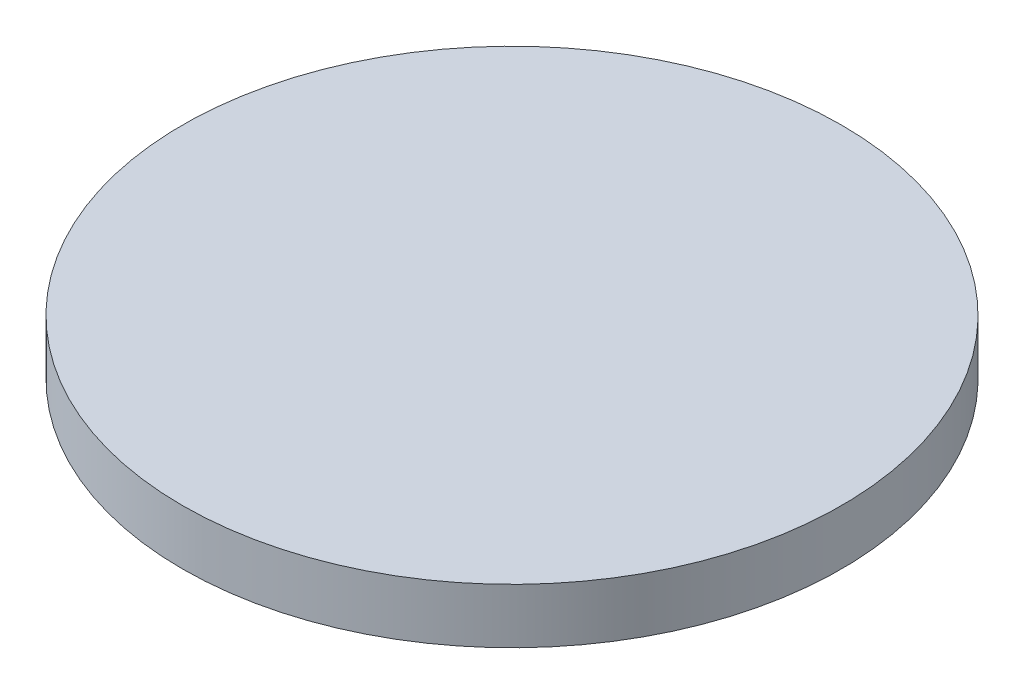
ISO-10303-21;
HEADER;
FILE_DESCRIPTION(('STEP AP214'),'2;1');
FILE_NAME('part.step','',(''),(''),'','','');
FILE_SCHEMA(('AUTOMOTIVE_DESIGN { 1 0 10303 214 1 1 1 1 }'));
ENDSEC;
DATA;
#1=APPLICATION_CONTEXT('core data for automotive mechanical design processes');
#2=APPLICATION_PROTOCOL_DEFINITION('international standard','automotive_design',2000,#1);
#3=PRODUCT_CONTEXT('',#1,'mechanical');
#4=PRODUCT('Part','Part','',(#3));
#5=PRODUCT_RELATED_PRODUCT_CATEGORY('part','',(#4));
#6=PRODUCT_DEFINITION_FORMATION('','',#4);
#7=PRODUCT_DEFINITION_CONTEXT('part definition',#1,'design');
#8=PRODUCT_DEFINITION('design','',#6,#7);
#9=PRODUCT_DEFINITION_SHAPE('','',#8);
#10=(LENGTH_UNIT() NAMED_UNIT(*) SI_UNIT(.MILLI.,.METRE.));
#11=(NAMED_UNIT(*) PLANE_ANGLE_UNIT() SI_UNIT($,.RADIAN.));
#12=(NAMED_UNIT(*) SI_UNIT($,.STERADIAN.) SOLID_ANGLE_UNIT());
#13=UNCERTAINTY_MEASURE_WITH_UNIT(LENGTH_MEASURE(1.E-05),#10,'distance_accuracy_value','');
#14=(GEOMETRIC_REPRESENTATION_CONTEXT(3) GLOBAL_UNCERTAINTY_ASSIGNED_CONTEXT((#13)) GLOBAL_UNIT_ASSIGNED_CONTEXT((#10,
#11,#12)) REPRESENTATION_CONTEXT('',''));
#15=CARTESIAN_POINT('',(0.,0.,0.));
#16=DIRECTION('',(0.,0.,1.));
#17=DIRECTION('',(1.,0.,0.));
#18=AXIS2_PLACEMENT_3D('',#15,#16,#17);
#19=CARTESIAN_POINT('',(-30.6000568267286,10.,-32.332135515034));
#20=DIRECTION('',(0.,-1.,0.));
#21=DIRECTION('',(0.,0.,-1.));
#22=AXIS2_PLACEMENT_3D('',#19,#20,#21);
#23=CYLINDRICAL_SURFACE('',#22,60.);
#24=CARTESIAN_POINT('',(-30.6000568267286,10.,-32.332135515034));
#25=DIRECTION('',(0.,1.,0.));
#26=DIRECTION('',(0.,0.,1.));
#27=AXIS2_PLACEMENT_3D('',#24,#25,#26);
#28=CIRCLE('',#27,60.);
#29=CARTESIAN_POINT('',(-30.6000568267286,10.,27.667864484966));
#30=VERTEX_POINT('',#29);
#31=EDGE_CURVE('E10',#30,#30,#28,.T.);
#32=ORIENTED_EDGE('',*,*,#31,.F.);
#33=EDGE_LOOP('',(#32));
#34=FACE_BOUND('',#33,.T.);
#35=CARTESIAN_POINT('',(-30.6000568267286,0.,-32.332135515034));
#36=DIRECTION('',(0.,1.,0.));
#37=DIRECTION('',(0.,0.,1.));
#38=AXIS2_PLACEMENT_3D('',#35,#36,#37);
#39=CIRCLE('',#38,60.);
#40=CARTESIAN_POINT('',(-30.6000568267286,0.,27.667864484966));
#41=VERTEX_POINT('',#40);
#42=EDGE_CURVE('E37',#41,#41,#39,.T.);
#43=ORIENTED_EDGE('',*,*,#42,.T.);
#44=EDGE_LOOP('',(#43));
#45=FACE_BOUND('',#44,.T.);
#46=ADVANCED_FACE('F40',(#34,#45),#23,.T.);
#47=CARTESIAN_POINT('',(-30.6000568267286,10.,-32.332135515034));
#48=DIRECTION('',(0.,1.,0.));
#49=DIRECTION('',(0.,0.,1.));
#50=AXIS2_PLACEMENT_3D('',#47,#48,#49);
#51=PLANE('',#50);
#52=ORIENTED_EDGE('',*,*,#31,.T.);
#53=EDGE_LOOP('',(#52));
#54=FACE_BOUND('',#53,.T.);
#55=ADVANCED_FACE('F55',(#54),#51,.T.);
#56=CARTESIAN_POINT('',(-30.6000568267286,0.,-32.332135515034));
#57=DIRECTION('',(0.,1.,0.));
#58=DIRECTION('',(0.,0.,1.));
#59=AXIS2_PLACEMENT_3D('',#56,#57,#58);
#60=PLANE('',#59);
#61=ORIENTED_EDGE('',*,*,#42,.F.);
#62=EDGE_LOOP('',(#61));
#63=FACE_BOUND('',#62,.T.);
#64=ADVANCED_FACE('F49',(#63),#60,.F.);
#65=CLOSED_SHELL('',(#46,#55,#64));
#66=MANIFOLD_SOLID_BREP('B2',#65);
#67=ADVANCED_BREP_SHAPE_REPRESENTATION('',(#18,#66),#14);
#68=SHAPE_DEFINITION_REPRESENTATION(#9,#67);
ENDSEC;
END-ISO-10303-21;
